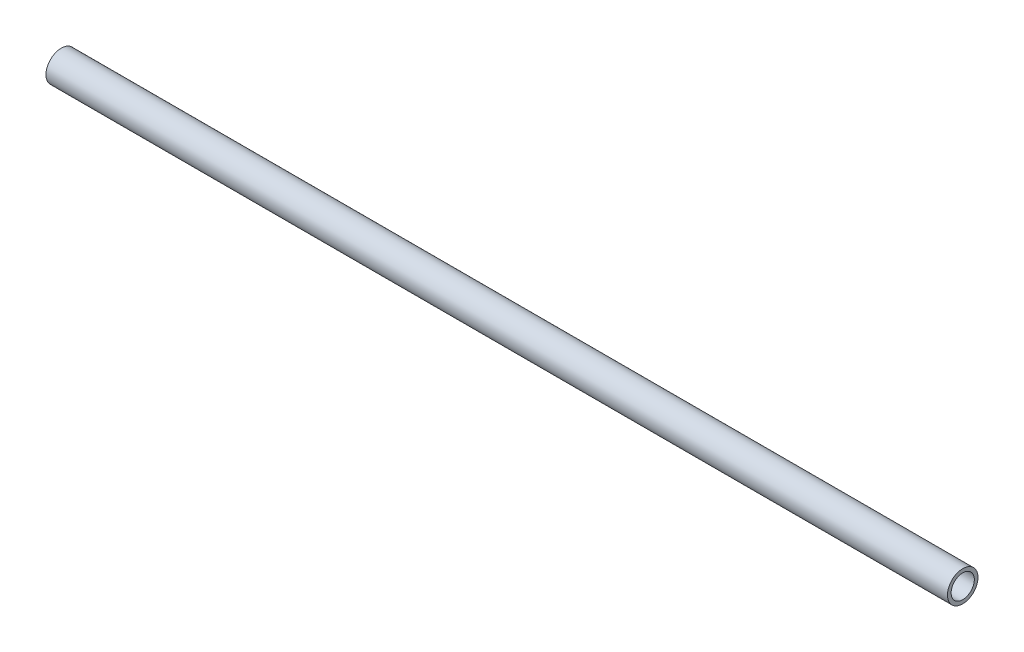
ISO-10303-21;
HEADER;
FILE_DESCRIPTION(('STEP AP214'),'2;1');
FILE_NAME('part.step','',(''),(''),'','','');
FILE_SCHEMA(('AUTOMOTIVE_DESIGN { 1 0 10303 214 1 1 1 1 }'));
ENDSEC;
DATA;
#1=APPLICATION_CONTEXT('core data for automotive mechanical design processes');
#2=APPLICATION_PROTOCOL_DEFINITION('international standard','automotive_design',2000,#1);
#3=PRODUCT_CONTEXT('',#1,'mechanical');
#4=PRODUCT('Part','Part','',(#3));
#5=PRODUCT_RELATED_PRODUCT_CATEGORY('part','',(#4));
#6=PRODUCT_DEFINITION_FORMATION('','',#4);
#7=PRODUCT_DEFINITION_CONTEXT('part definition',#1,'design');
#8=PRODUCT_DEFINITION('design','',#6,#7);
#9=PRODUCT_DEFINITION_SHAPE('','',#8);
#10=(LENGTH_UNIT() NAMED_UNIT(*) SI_UNIT(.MILLI.,.METRE.));
#11=(NAMED_UNIT(*) PLANE_ANGLE_UNIT() SI_UNIT($,.RADIAN.));
#12=(NAMED_UNIT(*) SI_UNIT($,.STERADIAN.) SOLID_ANGLE_UNIT());
#13=UNCERTAINTY_MEASURE_WITH_UNIT(LENGTH_MEASURE(1.E-05),#10,'distance_accuracy_value','');
#14=(GEOMETRIC_REPRESENTATION_CONTEXT(3) GLOBAL_UNCERTAINTY_ASSIGNED_CONTEXT((#13)) GLOBAL_UNIT_ASSIGNED_CONTEXT((#10,
#11,#12)) REPRESENTATION_CONTEXT('',''));
#15=CARTESIAN_POINT('',(0.,0.,0.));
#16=DIRECTION('',(0.,0.,1.));
#17=DIRECTION('',(1.,0.,0.));
#18=AXIS2_PLACEMENT_3D('',#15,#16,#17);
#19=CARTESIAN_POINT('',(750.,0.,0.));
#20=DIRECTION('',(1.,0.,0.));
#21=DIRECTION('',(0.,0.,-1.));
#22=AXIS2_PLACEMENT_3D('',#19,#20,#21);
#23=PLANE('',#22);
#24=CARTESIAN_POINT('',(750.,0.,0.));
#25=DIRECTION('',(1.,0.,0.));
#26=DIRECTION('',(0.,0.,-1.));
#27=AXIS2_PLACEMENT_3D('',#24,#25,#26);
#28=CIRCLE('',#27,12.7);
#29=CARTESIAN_POINT('',(750.,0.,-12.7));
#30=VERTEX_POINT('',#29);
#31=EDGE_CURVE('E10',#30,#30,#28,.T.);
#32=ORIENTED_EDGE('',*,*,#31,.T.);
#33=EDGE_LOOP('',(#32));
#34=FACE_BOUND('',#33,.T.);
#35=CARTESIAN_POINT('',(750.,0.,0.));
#36=DIRECTION('',(1.,0.,0.));
#37=DIRECTION('',(0.,0.,-1.));
#38=AXIS2_PLACEMENT_3D('',#35,#36,#37);
#39=CIRCLE('',#38,9.652);
#40=CARTESIAN_POINT('',(750.,0.,-9.652));
#41=VERTEX_POINT('',#40);
#42=EDGE_CURVE('E45',#41,#41,#39,.T.);
#43=ORIENTED_EDGE('',*,*,#42,.F.);
#44=EDGE_LOOP('',(#43));
#45=FACE_BOUND('',#44,.T.);
#46=ADVANCED_FACE('F34',(#34,#45),#23,.T.);
#47=CARTESIAN_POINT('',(0.,0.,0.));
#48=DIRECTION('',(1.,0.,0.));
#49=DIRECTION('',(0.,0.,-1.));
#50=AXIS2_PLACEMENT_3D('',#47,#48,#49);
#51=PLANE('',#50);
#52=CARTESIAN_POINT('',(0.,0.,0.));
#53=DIRECTION('',(1.,0.,0.));
#54=DIRECTION('',(0.,0.,-1.));
#55=AXIS2_PLACEMENT_3D('',#52,#53,#54);
#56=CIRCLE('',#55,12.7);
#57=CARTESIAN_POINT('',(0.,0.,-12.7));
#58=VERTEX_POINT('',#57);
#59=EDGE_CURVE('E38',#58,#58,#56,.T.);
#60=ORIENTED_EDGE('',*,*,#59,.F.);
#61=EDGE_LOOP('',(#60));
#62=FACE_BOUND('',#61,.T.);
#63=CARTESIAN_POINT('',(0.,0.,0.));
#64=DIRECTION('',(1.,0.,0.));
#65=DIRECTION('',(0.,0.,-1.));
#66=AXIS2_PLACEMENT_3D('',#63,#64,#65);
#67=CIRCLE('',#66,9.652);
#68=CARTESIAN_POINT('',(0.,0.,-9.652));
#69=VERTEX_POINT('',#68);
#70=EDGE_CURVE('E47',#69,#69,#67,.T.);
#71=ORIENTED_EDGE('',*,*,#70,.T.);
#72=EDGE_LOOP('',(#71));
#73=FACE_BOUND('',#72,.T.);
#74=ADVANCED_FACE('F57',(#62,#73),#51,.F.);
#75=CARTESIAN_POINT('',(750.,0.,0.));
#76=DIRECTION('',(-1.,0.,0.));
#77=DIRECTION('',(0.,0.,1.));
#78=AXIS2_PLACEMENT_3D('',#75,#76,#77);
#79=CYLINDRICAL_SURFACE('',#78,12.7);
#80=ORIENTED_EDGE('',*,*,#31,.F.);
#81=EDGE_LOOP('',(#80));
#82=FACE_BOUND('',#81,.T.);
#83=ORIENTED_EDGE('',*,*,#59,.T.);
#84=EDGE_LOOP('',(#83));
#85=FACE_BOUND('',#84,.T.);
#86=ADVANCED_FACE('F36',(#82,#85),#79,.T.);
#87=CARTESIAN_POINT('',(750.,0.,0.));
#88=DIRECTION('',(-1.,0.,0.));
#89=DIRECTION('',(0.,0.,1.));
#90=AXIS2_PLACEMENT_3D('',#87,#88,#89);
#91=CYLINDRICAL_SURFACE('',#90,9.652);
#92=ORIENTED_EDGE('',*,*,#42,.T.);
#93=EDGE_LOOP('',(#92));
#94=FACE_BOUND('',#93,.T.);
#95=ORIENTED_EDGE('',*,*,#70,.F.);
#96=EDGE_LOOP('',(#95));
#97=FACE_BOUND('',#96,.T.);
#98=ADVANCED_FACE('F53',(#94,#97),#91,.F.);
#99=CLOSED_SHELL('',(#46,#74,#86,#98));
#100=MANIFOLD_SOLID_BREP('B2',#99);
#101=ADVANCED_BREP_SHAPE_REPRESENTATION('',(#18,#100),#14);
#102=SHAPE_DEFINITION_REPRESENTATION(#9,#101);
ENDSEC;
END-ISO-10303-21;
